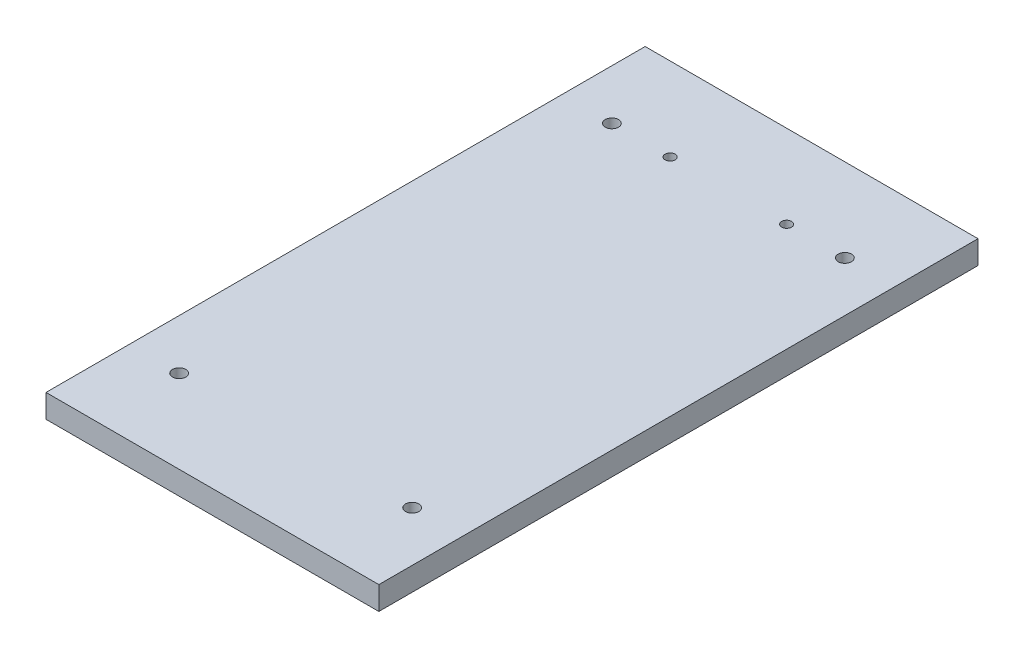
ISO-10303-21;
HEADER;
FILE_DESCRIPTION(('STEP AP214'),'2;1');
FILE_NAME('part.step','',(''),(''),'','','');
FILE_SCHEMA(('AUTOMOTIVE_DESIGN { 1 0 10303 214 1 1 1 1 }'));
ENDSEC;
DATA;
#1=APPLICATION_CONTEXT('core data for automotive mechanical design processes');
#2=APPLICATION_PROTOCOL_DEFINITION('international standard','automotive_design',2000,#1);
#3=PRODUCT_CONTEXT('',#1,'mechanical');
#4=PRODUCT('Part','Part','',(#3));
#5=PRODUCT_RELATED_PRODUCT_CATEGORY('part','',(#4));
#6=PRODUCT_DEFINITION_FORMATION('','',#4);
#7=PRODUCT_DEFINITION_CONTEXT('part definition',#1,'design');
#8=PRODUCT_DEFINITION('design','',#6,#7);
#9=PRODUCT_DEFINITION_SHAPE('','',#8);
#10=(LENGTH_UNIT() NAMED_UNIT(*) SI_UNIT(.MILLI.,.METRE.));
#11=(NAMED_UNIT(*) PLANE_ANGLE_UNIT() SI_UNIT($,.RADIAN.));
#12=(NAMED_UNIT(*) SI_UNIT($,.STERADIAN.) SOLID_ANGLE_UNIT());
#13=UNCERTAINTY_MEASURE_WITH_UNIT(LENGTH_MEASURE(1.E-05),#10,'distance_accuracy_value','');
#14=(GEOMETRIC_REPRESENTATION_CONTEXT(3) GLOBAL_UNCERTAINTY_ASSIGNED_CONTEXT((#13)) GLOBAL_UNIT_ASSIGNED_CONTEXT((#10,
#11,#12)) REPRESENTATION_CONTEXT('',''));
#15=CARTESIAN_POINT('',(0.,0.,0.));
#16=DIRECTION('',(0.,0.,1.));
#17=DIRECTION('',(1.,0.,0.));
#18=AXIS2_PLACEMENT_3D('',#15,#16,#17);
#19=CARTESIAN_POINT('',(0.,7.,0.));
#20=DIRECTION('',(1.,0.,0.));
#21=DIRECTION('',(0.,0.,-1.));
#22=AXIS2_PLACEMENT_3D('',#19,#20,#21);
#23=PLANE('',#22);
#24=DIRECTION('',(0.,0.,1.));
#25=VECTOR('',#24,1.);
#26=CARTESIAN_POINT('',(0.,0.,0.));
#27=LINE('',#26,#25);
#28=CARTESIAN_POINT('',(0.,0.,-180.));
#29=VERTEX_POINT('',#28);
#30=CARTESIAN_POINT('',(0.,0.,0.));
#31=VERTEX_POINT('',#30);
#32=EDGE_CURVE('E107',#29,#31,#27,.T.);
#33=ORIENTED_EDGE('',*,*,#32,.T.);
#34=DIRECTION('',(0.,-1.,0.));
#35=VECTOR('',#34,1.);
#36=CARTESIAN_POINT('',(0.,7.,0.));
#37=LINE('',#36,#35);
#38=CARTESIAN_POINT('',(0.,7.,0.));
#39=VERTEX_POINT('',#38);
#40=EDGE_CURVE('E11',#39,#31,#37,.T.);
#41=ORIENTED_EDGE('',*,*,#40,.F.);
#42=DIRECTION('',(0.,0.,1.));
#43=VECTOR('',#42,1.);
#44=CARTESIAN_POINT('',(0.,7.,0.));
#45=LINE('',#44,#43);
#46=CARTESIAN_POINT('',(0.,7.,-180.));
#47=VERTEX_POINT('',#46);
#48=EDGE_CURVE('E91',#47,#39,#45,.T.);
#49=ORIENTED_EDGE('',*,*,#48,.F.);
#50=DIRECTION('',(0.,-1.,0.));
#51=VECTOR('',#50,1.);
#52=CARTESIAN_POINT('',(0.,7.,-180.));
#53=LINE('',#52,#51);
#54=EDGE_CURVE('E103',#47,#29,#53,.T.);
#55=ORIENTED_EDGE('',*,*,#54,.T.);
#56=EDGE_LOOP('',(#33,#41,#49,#55));
#57=FACE_BOUND('',#56,.T.);
#58=ADVANCED_FACE('F39',(#57),#23,.F.);
#59=CARTESIAN_POINT('',(0.,7.,0.));
#60=DIRECTION('',(0.,0.,-1.));
#61=DIRECTION('',(-1.,0.,0.));
#62=AXIS2_PLACEMENT_3D('',#59,#60,#61);
#63=PLANE('',#62);
#64=DIRECTION('',(1.,0.,0.));
#65=VECTOR('',#64,1.);
#66=CARTESIAN_POINT('',(0.,0.,0.));
#67=LINE('',#66,#65);
#68=CARTESIAN_POINT('',(100.,0.,0.));
#69=VERTEX_POINT('',#68);
#70=EDGE_CURVE('E96',#31,#69,#67,.T.);
#71=ORIENTED_EDGE('',*,*,#70,.T.);
#72=DIRECTION('',(0.,-1.,0.));
#73=VECTOR('',#72,1.);
#74=CARTESIAN_POINT('',(100.,7.,0.));
#75=LINE('',#74,#73);
#76=CARTESIAN_POINT('',(100.,7.,0.));
#77=VERTEX_POINT('',#76);
#78=EDGE_CURVE('E48',#77,#69,#75,.T.);
#79=ORIENTED_EDGE('',*,*,#78,.F.);
#80=DIRECTION('',(1.,0.,0.));
#81=VECTOR('',#80,1.);
#82=CARTESIAN_POINT('',(0.,7.,0.));
#83=LINE('',#82,#81);
#84=EDGE_CURVE('E86',#39,#77,#83,.T.);
#85=ORIENTED_EDGE('',*,*,#84,.F.);
#86=ORIENTED_EDGE('',*,*,#40,.T.);
#87=EDGE_LOOP('',(#71,#79,#85,#86));
#88=FACE_BOUND('',#87,.T.);
#89=ADVANCED_FACE('F95',(#88),#63,.F.);
#90=CARTESIAN_POINT('',(100.,7.,0.));
#91=DIRECTION('',(-1.,0.,0.));
#92=DIRECTION('',(0.,0.,1.));
#93=AXIS2_PLACEMENT_3D('',#90,#91,#92);
#94=PLANE('',#93);
#95=DIRECTION('',(0.,0.,-1.));
#96=VECTOR('',#95,1.);
#97=CARTESIAN_POINT('',(100.,0.,0.));
#98=LINE('',#97,#96);
#99=CARTESIAN_POINT('',(100.,0.,-180.));
#100=VERTEX_POINT('',#99);
#101=EDGE_CURVE('E73',#69,#100,#98,.T.);
#102=ORIENTED_EDGE('',*,*,#101,.T.);
#103=DIRECTION('',(0.,-1.,0.));
#104=VECTOR('',#103,1.);
#105=CARTESIAN_POINT('',(100.,7.,-180.));
#106=LINE('',#105,#104);
#107=CARTESIAN_POINT('',(100.,7.,-180.));
#108=VERTEX_POINT('',#107);
#109=EDGE_CURVE('E98',#108,#100,#106,.T.);
#110=ORIENTED_EDGE('',*,*,#109,.F.);
#111=DIRECTION('',(0.,0.,-1.));
#112=VECTOR('',#111,1.);
#113=CARTESIAN_POINT('',(100.,7.,0.));
#114=LINE('',#113,#112);
#115=EDGE_CURVE('E89',#77,#108,#114,.T.);
#116=ORIENTED_EDGE('',*,*,#115,.F.);
#117=ORIENTED_EDGE('',*,*,#78,.T.);
#118=EDGE_LOOP('',(#102,#110,#116,#117));
#119=FACE_BOUND('',#118,.T.);
#120=ADVANCED_FACE('F99',(#119),#94,.F.);
#121=CARTESIAN_POINT('',(0.,7.,-180.));
#122=DIRECTION('',(0.,0.,1.));
#123=DIRECTION('',(1.,0.,0.));
#124=AXIS2_PLACEMENT_3D('',#121,#122,#123);
#125=PLANE('',#124);
#126=DIRECTION('',(-1.,0.,0.));
#127=VECTOR('',#126,1.);
#128=CARTESIAN_POINT('',(0.,0.,-180.));
#129=LINE('',#128,#127);
#130=EDGE_CURVE('E79',#100,#29,#129,.T.);
#131=ORIENTED_EDGE('',*,*,#130,.T.);
#132=ORIENTED_EDGE('',*,*,#54,.F.);
#133=DIRECTION('',(-1.,0.,0.));
#134=VECTOR('',#133,1.);
#135=CARTESIAN_POINT('',(0.,7.,-180.));
#136=LINE('',#135,#134);
#137=EDGE_CURVE('E56',#108,#47,#136,.T.);
#138=ORIENTED_EDGE('',*,*,#137,.F.);
#139=ORIENTED_EDGE('',*,*,#109,.T.);
#140=EDGE_LOOP('',(#131,#132,#138,#139));
#141=FACE_BOUND('',#140,.T.);
#142=ADVANCED_FACE('F121',(#141),#125,.F.);
#143=CARTESIAN_POINT('',(0.,7.,0.));
#144=DIRECTION('',(0.,-1.,0.));
#145=DIRECTION('',(0.,0.,-1.));
#146=AXIS2_PLACEMENT_3D('',#143,#144,#145);
#147=PLANE('',#146);
#148=CARTESIAN_POINT('',(32.5,7.,-155.));
#149=DIRECTION('',(0.,1.,0.));
#150=DIRECTION('',(0.,0.,1.));
#151=AXIS2_PLACEMENT_3D('',#148,#149,#150);
#152=CIRCLE('',#151,1.50000000000002);
#153=CARTESIAN_POINT('',(32.5,7.,-153.5));
#154=VERTEX_POINT('',#153);
#155=EDGE_CURVE('E168',#154,#154,#152,.T.);
#156=ORIENTED_EDGE('',*,*,#155,.F.);
#157=EDGE_LOOP('',(#156));
#158=FACE_BOUND('',#157,.T.);
#159=CARTESIAN_POINT('',(67.5,7.,-155.));
#160=DIRECTION('',(0.,1.,0.));
#161=DIRECTION('',(0.,0.,1.));
#162=AXIS2_PLACEMENT_3D('',#159,#160,#161);
#163=CIRCLE('',#162,1.50000000000002);
#164=CARTESIAN_POINT('',(67.5,7.,-153.5));
#165=VERTEX_POINT('',#164);
#166=EDGE_CURVE('E160',#165,#165,#163,.T.);
#167=ORIENTED_EDGE('',*,*,#166,.F.);
#168=EDGE_LOOP('',(#167));
#169=FACE_BOUND('',#168,.T.);
#170=CARTESIAN_POINT('',(85.,7.,-25.));
#171=DIRECTION('',(0.,1.,0.));
#172=DIRECTION('',(0.,0.,1.));
#173=AXIS2_PLACEMENT_3D('',#170,#171,#172);
#174=CIRCLE('',#173,2.);
#175=CARTESIAN_POINT('',(85.,7.,-23.));
#176=VERTEX_POINT('',#175);
#177=EDGE_CURVE('E145',#176,#176,#174,.T.);
#178=ORIENTED_EDGE('',*,*,#177,.F.);
#179=EDGE_LOOP('',(#178));
#180=FACE_BOUND('',#179,.T.);
#181=CARTESIAN_POINT('',(14.9999999999995,7.,-155.));
#182=DIRECTION('',(0.,1.,0.));
#183=DIRECTION('',(0.,0.,1.));
#184=AXIS2_PLACEMENT_3D('',#181,#182,#183);
#185=CIRCLE('',#184,2.);
#186=CARTESIAN_POINT('',(14.9999999999995,7.,-153.));
#187=VERTEX_POINT('',#186);
#188=EDGE_CURVE('E136',#187,#187,#185,.T.);
#189=ORIENTED_EDGE('',*,*,#188,.F.);
#190=EDGE_LOOP('',(#189));
#191=FACE_BOUND('',#190,.T.);
#192=CARTESIAN_POINT('',(84.9999999999995,7.,-155.));
#193=DIRECTION('',(0.,1.,0.));
#194=DIRECTION('',(0.,0.,1.));
#195=AXIS2_PLACEMENT_3D('',#192,#193,#194);
#196=CIRCLE('',#195,2.);
#197=CARTESIAN_POINT('',(84.9999999999995,7.,-153.));
#198=VERTEX_POINT('',#197);
#199=EDGE_CURVE('E152',#198,#198,#196,.T.);
#200=ORIENTED_EDGE('',*,*,#199,.F.);
#201=EDGE_LOOP('',(#200));
#202=FACE_BOUND('',#201,.T.);
#203=CARTESIAN_POINT('',(15.,7.,-25.));
#204=DIRECTION('',(0.,1.,0.));
#205=DIRECTION('',(0.,0.,1.));
#206=AXIS2_PLACEMENT_3D('',#203,#204,#205);
#207=CIRCLE('',#206,2.);
#208=CARTESIAN_POINT('',(15.,7.,-23.));
#209=VERTEX_POINT('',#208);
#210=EDGE_CURVE('E128',#209,#209,#207,.T.);
#211=ORIENTED_EDGE('',*,*,#210,.F.);
#212=EDGE_LOOP('',(#211));
#213=FACE_BOUND('',#212,.T.);
#214=ORIENTED_EDGE('',*,*,#48,.T.);
#215=ORIENTED_EDGE('',*,*,#84,.T.);
#216=ORIENTED_EDGE('',*,*,#115,.T.);
#217=ORIENTED_EDGE('',*,*,#137,.T.);
#218=EDGE_LOOP('',(#214,#215,#216,#217));
#219=FACE_BOUND('',#218,.T.);
#220=ADVANCED_FACE('F87',(#158,#169,#180,#191,#202,#213,#219),#147,.F.);
#221=CARTESIAN_POINT('',(0.,0.,0.));
#222=DIRECTION('',(0.,-1.,0.));
#223=DIRECTION('',(0.,0.,-1.));
#224=AXIS2_PLACEMENT_3D('',#221,#222,#223);
#225=PLANE('',#224);
#226=CARTESIAN_POINT('',(32.5,0.,-155.));
#227=DIRECTION('',(0.,1.,0.));
#228=DIRECTION('',(0.,0.,1.));
#229=AXIS2_PLACEMENT_3D('',#226,#227,#228);
#230=CIRCLE('',#229,1.50000000000002);
#231=CARTESIAN_POINT('',(32.5,0.,-153.5));
#232=VERTEX_POINT('',#231);
#233=EDGE_CURVE('E156',#232,#232,#230,.T.);
#234=ORIENTED_EDGE('',*,*,#233,.T.);
#235=EDGE_LOOP('',(#234));
#236=FACE_BOUND('',#235,.T.);
#237=CARTESIAN_POINT('',(67.5,0.,-155.));
#238=DIRECTION('',(0.,1.,0.));
#239=DIRECTION('',(0.,0.,1.));
#240=AXIS2_PLACEMENT_3D('',#237,#238,#239);
#241=CIRCLE('',#240,1.50000000000002);
#242=CARTESIAN_POINT('',(67.5,0.,-153.5));
#243=VERTEX_POINT('',#242);
#244=EDGE_CURVE('E164',#243,#243,#241,.T.);
#245=ORIENTED_EDGE('',*,*,#244,.T.);
#246=EDGE_LOOP('',(#245));
#247=FACE_BOUND('',#246,.T.);
#248=CARTESIAN_POINT('',(85.,0.,-25.));
#249=DIRECTION('',(0.,1.,0.));
#250=DIRECTION('',(0.,0.,1.));
#251=AXIS2_PLACEMENT_3D('',#248,#249,#250);
#252=CIRCLE('',#251,2.);
#253=CARTESIAN_POINT('',(85.,0.,-23.));
#254=VERTEX_POINT('',#253);
#255=EDGE_CURVE('E132',#254,#254,#252,.T.);
#256=ORIENTED_EDGE('',*,*,#255,.T.);
#257=EDGE_LOOP('',(#256));
#258=FACE_BOUND('',#257,.T.);
#259=CARTESIAN_POINT('',(14.9999999999995,0.,-155.));
#260=DIRECTION('',(0.,1.,0.));
#261=DIRECTION('',(0.,0.,1.));
#262=AXIS2_PLACEMENT_3D('',#259,#260,#261);
#263=CIRCLE('',#262,2.);
#264=CARTESIAN_POINT('',(14.9999999999995,0.,-153.));
#265=VERTEX_POINT('',#264);
#266=EDGE_CURVE('E140',#265,#265,#263,.T.);
#267=ORIENTED_EDGE('',*,*,#266,.T.);
#268=EDGE_LOOP('',(#267));
#269=FACE_BOUND('',#268,.T.);
#270=CARTESIAN_POINT('',(84.9999999999995,0.,-155.));
#271=DIRECTION('',(0.,1.,0.));
#272=DIRECTION('',(0.,0.,1.));
#273=AXIS2_PLACEMENT_3D('',#270,#271,#272);
#274=CIRCLE('',#273,2.);
#275=CARTESIAN_POINT('',(84.9999999999995,0.,-153.));
#276=VERTEX_POINT('',#275);
#277=EDGE_CURVE('E141',#276,#276,#274,.T.);
#278=ORIENTED_EDGE('',*,*,#277,.T.);
#279=EDGE_LOOP('',(#278));
#280=FACE_BOUND('',#279,.T.);
#281=CARTESIAN_POINT('',(15.,0.,-25.));
#282=DIRECTION('',(0.,1.,0.));
#283=DIRECTION('',(0.,0.,1.));
#284=AXIS2_PLACEMENT_3D('',#281,#282,#283);
#285=CIRCLE('',#284,2.);
#286=CARTESIAN_POINT('',(15.,0.,-23.));
#287=VERTEX_POINT('',#286);
#288=EDGE_CURVE('E111',#287,#287,#285,.T.);
#289=ORIENTED_EDGE('',*,*,#288,.T.);
#290=EDGE_LOOP('',(#289));
#291=FACE_BOUND('',#290,.T.);
#292=ORIENTED_EDGE('',*,*,#32,.F.);
#293=ORIENTED_EDGE('',*,*,#130,.F.);
#294=ORIENTED_EDGE('',*,*,#101,.F.);
#295=ORIENTED_EDGE('',*,*,#70,.F.);
#296=EDGE_LOOP('',(#292,#293,#294,#295));
#297=FACE_BOUND('',#296,.T.);
#298=ADVANCED_FACE('F124',(#236,#247,#258,#269,#280,#291,#297),#225,.T.);
#299=CARTESIAN_POINT('',(15.,0.,-25.));
#300=DIRECTION('',(0.,1.,0.));
#301=DIRECTION('',(0.,0.,1.));
#302=AXIS2_PLACEMENT_3D('',#299,#300,#301);
#303=CYLINDRICAL_SURFACE('',#302,2.);
#304=ORIENTED_EDGE('',*,*,#288,.F.);
#305=EDGE_LOOP('',(#304));
#306=FACE_BOUND('',#305,.T.);
#307=ORIENTED_EDGE('',*,*,#210,.T.);
#308=EDGE_LOOP('',(#307));
#309=FACE_BOUND('',#308,.T.);
#310=ADVANCED_FACE('F198',(#306,#309),#303,.F.);
#311=CARTESIAN_POINT('',(84.9999999999995,0.,-155.));
#312=DIRECTION('',(0.,1.,0.));
#313=DIRECTION('',(0.,0.,1.));
#314=AXIS2_PLACEMENT_3D('',#311,#312,#313);
#315=CYLINDRICAL_SURFACE('',#314,2.);
#316=ORIENTED_EDGE('',*,*,#277,.F.);
#317=EDGE_LOOP('',(#316));
#318=FACE_BOUND('',#317,.T.);
#319=ORIENTED_EDGE('',*,*,#199,.T.);
#320=EDGE_LOOP('',(#319));
#321=FACE_BOUND('',#320,.T.);
#322=ADVANCED_FACE('F200',(#318,#321),#315,.F.);
#323=CARTESIAN_POINT('',(14.9999999999995,0.,-155.));
#324=DIRECTION('',(0.,1.,0.));
#325=DIRECTION('',(0.,0.,1.));
#326=AXIS2_PLACEMENT_3D('',#323,#324,#325);
#327=CYLINDRICAL_SURFACE('',#326,2.);
#328=ORIENTED_EDGE('',*,*,#266,.F.);
#329=EDGE_LOOP('',(#328));
#330=FACE_BOUND('',#329,.T.);
#331=ORIENTED_EDGE('',*,*,#188,.T.);
#332=EDGE_LOOP('',(#331));
#333=FACE_BOUND('',#332,.T.);
#334=ADVANCED_FACE('F207',(#330,#333),#327,.F.);
#335=CARTESIAN_POINT('',(85.,0.,-25.));
#336=DIRECTION('',(0.,1.,0.));
#337=DIRECTION('',(0.,0.,1.));
#338=AXIS2_PLACEMENT_3D('',#335,#336,#337);
#339=CYLINDRICAL_SURFACE('',#338,2.);
#340=ORIENTED_EDGE('',*,*,#255,.F.);
#341=EDGE_LOOP('',(#340));
#342=FACE_BOUND('',#341,.T.);
#343=ORIENTED_EDGE('',*,*,#177,.T.);
#344=EDGE_LOOP('',(#343));
#345=FACE_BOUND('',#344,.T.);
#346=ADVANCED_FACE('F246',(#342,#345),#339,.F.);
#347=CARTESIAN_POINT('',(67.5,0.,-155.));
#348=DIRECTION('',(0.,1.,0.));
#349=DIRECTION('',(0.,0.,1.));
#350=AXIS2_PLACEMENT_3D('',#347,#348,#349);
#351=CYLINDRICAL_SURFACE('',#350,1.50000000000002);
#352=ORIENTED_EDGE('',*,*,#244,.F.);
#353=EDGE_LOOP('',(#352));
#354=FACE_BOUND('',#353,.T.);
#355=ORIENTED_EDGE('',*,*,#166,.T.);
#356=EDGE_LOOP('',(#355));
#357=FACE_BOUND('',#356,.T.);
#358=ADVANCED_FACE('F181',(#354,#357),#351,.F.);
#359=CARTESIAN_POINT('',(32.5,0.,-155.));
#360=DIRECTION('',(0.,1.,0.));
#361=DIRECTION('',(0.,0.,1.));
#362=AXIS2_PLACEMENT_3D('',#359,#360,#361);
#363=CYLINDRICAL_SURFACE('',#362,1.50000000000002);
#364=ORIENTED_EDGE('',*,*,#233,.F.);
#365=EDGE_LOOP('',(#364));
#366=FACE_BOUND('',#365,.T.);
#367=ORIENTED_EDGE('',*,*,#155,.T.);
#368=EDGE_LOOP('',(#367));
#369=FACE_BOUND('',#368,.T.);
#370=ADVANCED_FACE('F178',(#366,#369),#363,.F.);
#371=CLOSED_SHELL('',(#58,#89,#120,#142,#220,#298,#310,#322,#334,#346,#358,#370));
#372=MANIFOLD_SOLID_BREP('B2',#371);
#373=ADVANCED_BREP_SHAPE_REPRESENTATION('',(#18,#372),#14);
#374=SHAPE_DEFINITION_REPRESENTATION(#9,#373);
ENDSEC;
END-ISO-10303-21;
